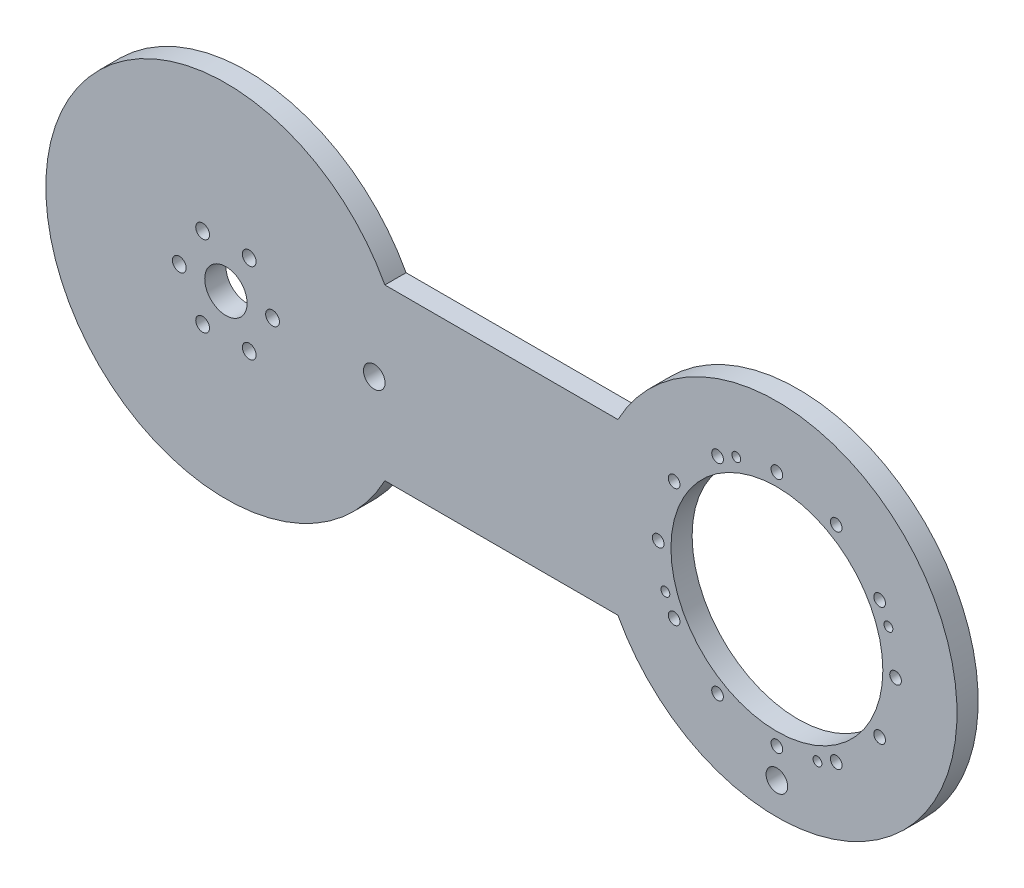
ISO-10303-21;
HEADER;
FILE_DESCRIPTION(('STEP AP214'),'2;1');
FILE_NAME('part.step','',(''),(''),'','','');
FILE_SCHEMA(('AUTOMOTIVE_DESIGN { 1 0 10303 214 1 1 1 1 }'));
ENDSEC;
DATA;
#1=APPLICATION_CONTEXT('core data for automotive mechanical design processes');
#2=APPLICATION_PROTOCOL_DEFINITION('international standard','automotive_design',2000,#1);
#3=PRODUCT_CONTEXT('',#1,'mechanical');
#4=PRODUCT('Part','Part','',(#3));
#5=PRODUCT_RELATED_PRODUCT_CATEGORY('part','',(#4));
#6=PRODUCT_DEFINITION_FORMATION('','',#4);
#7=PRODUCT_DEFINITION_CONTEXT('part definition',#1,'design');
#8=PRODUCT_DEFINITION('design','',#6,#7);
#9=PRODUCT_DEFINITION_SHAPE('','',#8);
#10=(LENGTH_UNIT() NAMED_UNIT(*) SI_UNIT(.MILLI.,.METRE.));
#11=(NAMED_UNIT(*) PLANE_ANGLE_UNIT() SI_UNIT($,.RADIAN.));
#12=(NAMED_UNIT(*) SI_UNIT($,.STERADIAN.) SOLID_ANGLE_UNIT());
#13=UNCERTAINTY_MEASURE_WITH_UNIT(LENGTH_MEASURE(1.E-05),#10,'distance_accuracy_value','');
#14=(GEOMETRIC_REPRESENTATION_CONTEXT(3) GLOBAL_UNCERTAINTY_ASSIGNED_CONTEXT((#13)) GLOBAL_UNIT_ASSIGNED_CONTEXT((#10,
#11,#12)) REPRESENTATION_CONTEXT('',''));
#15=CARTESIAN_POINT('',(0.,0.,0.));
#16=DIRECTION('',(0.,0.,1.));
#17=DIRECTION('',(1.,0.,0.));
#18=AXIS2_PLACEMENT_3D('',#15,#16,#17);
#19=CARTESIAN_POINT('',(0.,-40.,10.));
#20=DIRECTION('',(0.,1.,0.));
#21=DIRECTION('',(0.,0.,1.));
#22=AXIS2_PLACEMENT_3D('',#19,#20,#21);
#23=PLANE('',#22);
#24=DIRECTION('',(0.,0.,-1.));
#25=VECTOR('',#24,1.);
#26=CARTESIAN_POINT('',(185.,-40.,10.));
#27=LINE('',#26,#25);
#28=CARTESIAN_POINT('',(185.,-40.,10.));
#29=VERTEX_POINT('',#28);
#30=CARTESIAN_POINT('',(185.,-40.,0.));
#31=VERTEX_POINT('',#30);
#32=EDGE_CURVE('E67',#29,#31,#27,.T.);
#33=ORIENTED_EDGE('',*,*,#32,.F.);
#34=DIRECTION('',(1.,0.,0.));
#35=VECTOR('',#34,1.);
#36=CARTESIAN_POINT('',(0.,-40.,10.));
#37=LINE('',#36,#35);
#38=CARTESIAN_POINT('',(75.,-40.,10.));
#39=VERTEX_POINT('',#38);
#40=EDGE_CURVE('E98',#39,#29,#37,.T.);
#41=ORIENTED_EDGE('',*,*,#40,.F.);
#42=DIRECTION('',(0.,0.,-1.));
#43=VECTOR('',#42,1.);
#44=CARTESIAN_POINT('',(75.,-40.,10.));
#45=LINE('',#44,#43);
#46=CARTESIAN_POINT('',(75.,-40.,0.));
#47=VERTEX_POINT('',#46);
#48=EDGE_CURVE('E104',#39,#47,#45,.T.);
#49=ORIENTED_EDGE('',*,*,#48,.T.);
#50=DIRECTION('',(1.,0.,0.));
#51=VECTOR('',#50,1.);
#52=CARTESIAN_POINT('',(0.,-40.,0.));
#53=LINE('',#52,#51);
#54=EDGE_CURVE('E63',#47,#31,#53,.T.);
#55=ORIENTED_EDGE('',*,*,#54,.T.);
#56=EDGE_LOOP('',(#33,#41,#49,#55));
#57=FACE_BOUND('',#56,.T.);
#58=ADVANCED_FACE('F47',(#57),#23,.F.);
#59=CARTESIAN_POINT('',(260.,40.,10.));
#60=DIRECTION('',(0.,-1.,0.));
#61=DIRECTION('',(0.,0.,-1.));
#62=AXIS2_PLACEMENT_3D('',#59,#60,#61);
#63=PLANE('',#62);
#64=DIRECTION('',(0.,0.,-1.));
#65=VECTOR('',#64,1.);
#66=CARTESIAN_POINT('',(185.,40.,10.));
#67=LINE('',#66,#65);
#68=CARTESIAN_POINT('',(185.,40.,0.));
#69=VERTEX_POINT('',#68);
#70=CARTESIAN_POINT('',(185.,40.,10.));
#71=VERTEX_POINT('',#70);
#72=EDGE_CURVE('E11',#69,#71,#67,.F.);
#73=ORIENTED_EDGE('',*,*,#72,.F.);
#74=DIRECTION('',(-1.,0.,0.));
#75=VECTOR('',#74,1.);
#76=CARTESIAN_POINT('',(260.,40.,0.));
#77=LINE('',#76,#75);
#78=CARTESIAN_POINT('',(75.,40.,0.));
#79=VERTEX_POINT('',#78);
#80=EDGE_CURVE('E89',#69,#79,#77,.T.);
#81=ORIENTED_EDGE('',*,*,#80,.T.);
#82=DIRECTION('',(0.,0.,-1.));
#83=VECTOR('',#82,1.);
#84=CARTESIAN_POINT('',(75.,40.,10.));
#85=LINE('',#84,#83);
#86=CARTESIAN_POINT('',(75.,40.,10.));
#87=VERTEX_POINT('',#86);
#88=EDGE_CURVE('E93',#79,#87,#85,.F.);
#89=ORIENTED_EDGE('',*,*,#88,.T.);
#90=DIRECTION('',(-1.,0.,0.));
#91=VECTOR('',#90,1.);
#92=CARTESIAN_POINT('',(260.,40.,10.));
#93=LINE('',#92,#91);
#94=EDGE_CURVE('E108',#71,#87,#93,.T.);
#95=ORIENTED_EDGE('',*,*,#94,.F.);
#96=EDGE_LOOP('',(#73,#81,#89,#95));
#97=FACE_BOUND('',#96,.T.);
#98=ADVANCED_FACE('F91',(#97),#63,.F.);
#99=CARTESIAN_POINT('',(0.,0.,10.));
#100=DIRECTION('',(0.,0.,-1.));
#101=DIRECTION('',(-1.,0.,0.));
#102=AXIS2_PLACEMENT_3D('',#99,#100,#101);
#103=CYLINDRICAL_SURFACE('',#102,85.);
#104=ORIENTED_EDGE('',*,*,#48,.F.);
#105=CARTESIAN_POINT('',(0.,0.,10.));
#106=DIRECTION('',(0.,0.,1.));
#107=DIRECTION('',(1.,0.,0.));
#108=AXIS2_PLACEMENT_3D('',#105,#106,#107);
#109=CIRCLE('',#108,85.);
#110=EDGE_CURVE('E56',#87,#39,#109,.T.);
#111=ORIENTED_EDGE('',*,*,#110,.F.);
#112=ORIENTED_EDGE('',*,*,#88,.F.);
#113=CARTESIAN_POINT('',(0.,0.,0.));
#114=DIRECTION('',(0.,0.,1.));
#115=DIRECTION('',(1.,0.,0.));
#116=AXIS2_PLACEMENT_3D('',#113,#114,#115);
#117=CIRCLE('',#116,85.);
#118=EDGE_CURVE('E100',#79,#47,#117,.T.);
#119=ORIENTED_EDGE('',*,*,#118,.T.);
#120=EDGE_LOOP('',(#104,#111,#112,#119));
#121=FACE_BOUND('',#120,.T.);
#122=ADVANCED_FACE('F49',(#121),#103,.T.);
#123=CARTESIAN_POINT('',(0.,0.,10.));
#124=DIRECTION('',(0.,0.,1.));
#125=DIRECTION('',(1.,0.,0.));
#126=AXIS2_PLACEMENT_3D('',#123,#124,#125);
#127=PLANE('',#126);
#128=CARTESIAN_POINT('',(308.497422611929,28.,10.));
#129=DIRECTION('',(0.,0.,1.));
#130=DIRECTION('',(1.,0.,0.));
#131=AXIS2_PLACEMENT_3D('',#128,#129,#130);
#132=CIRCLE('',#131,2.74999999999997);
#133=CARTESIAN_POINT('',(311.247422611929,28.,10.));
#134=VERTEX_POINT('',#133);
#135=EDGE_CURVE('E133',#134,#134,#132,.T.);
#136=ORIENTED_EDGE('',*,*,#135,.F.);
#137=EDGE_LOOP('',(#136));
#138=FACE_BOUND('',#137,.T.);
#139=CARTESIAN_POINT('',(288.,48.4974226119286,10.));
#140=DIRECTION('',(0.,0.,1.));
#141=DIRECTION('',(1.,0.,0.));
#142=AXIS2_PLACEMENT_3D('',#139,#140,#141);
#143=CIRCLE('',#142,2.74999999999997);
#144=CARTESIAN_POINT('',(290.75,48.4974226119286,10.));
#145=VERTEX_POINT('',#144);
#146=EDGE_CURVE('E138',#145,#145,#143,.T.);
#147=ORIENTED_EDGE('',*,*,#146,.F.);
#148=EDGE_LOOP('',(#147));
#149=FACE_BOUND('',#148,.T.);
#150=CARTESIAN_POINT('',(260.,56.,10.));
#151=DIRECTION('',(0.,0.,1.));
#152=DIRECTION('',(1.,0.,0.));
#153=AXIS2_PLACEMENT_3D('',#150,#151,#152);
#154=CIRCLE('',#153,2.74999999999997);
#155=CARTESIAN_POINT('',(262.75,56.,10.));
#156=VERTEX_POINT('',#155);
#157=EDGE_CURVE('E142',#156,#156,#154,.T.);
#158=ORIENTED_EDGE('',*,*,#157,.F.);
#159=EDGE_LOOP('',(#158));
#160=FACE_BOUND('',#159,.T.);
#161=CARTESIAN_POINT('',(232.,48.4974226119286,10.));
#162=DIRECTION('',(0.,0.,1.));
#163=DIRECTION('',(1.,0.,0.));
#164=AXIS2_PLACEMENT_3D('',#161,#162,#163);
#165=CIRCLE('',#164,2.75);
#166=CARTESIAN_POINT('',(234.75,48.4974226119286,10.));
#167=VERTEX_POINT('',#166);
#168=EDGE_CURVE('E146',#167,#167,#165,.T.);
#169=ORIENTED_EDGE('',*,*,#168,.F.);
#170=EDGE_LOOP('',(#169));
#171=FACE_BOUND('',#170,.T.);
#172=CARTESIAN_POINT('',(211.502577388071,28.,10.));
#173=DIRECTION('',(0.,0.,1.));
#174=DIRECTION('',(1.,0.,0.));
#175=AXIS2_PLACEMENT_3D('',#172,#173,#174);
#176=CIRCLE('',#175,2.75);
#177=CARTESIAN_POINT('',(214.252577388071,28.,10.));
#178=VERTEX_POINT('',#177);
#179=EDGE_CURVE('E150',#178,#178,#176,.T.);
#180=ORIENTED_EDGE('',*,*,#179,.F.);
#181=EDGE_LOOP('',(#180));
#182=FACE_BOUND('',#181,.T.);
#183=CARTESIAN_POINT('',(204.,0.,10.));
#184=DIRECTION('',(0.,0.,1.));
#185=DIRECTION('',(1.,0.,0.));
#186=AXIS2_PLACEMENT_3D('',#183,#184,#185);
#187=CIRCLE('',#186,2.75);
#188=CARTESIAN_POINT('',(206.75,0.,10.));
#189=VERTEX_POINT('',#188);
#190=EDGE_CURVE('E154',#189,#189,#187,.T.);
#191=ORIENTED_EDGE('',*,*,#190,.F.);
#192=EDGE_LOOP('',(#191));
#193=FACE_BOUND('',#192,.T.);
#194=CARTESIAN_POINT('',(211.502577388071,-28.,10.));
#195=DIRECTION('',(0.,0.,1.));
#196=DIRECTION('',(1.,0.,0.));
#197=AXIS2_PLACEMENT_3D('',#194,#195,#196);
#198=CIRCLE('',#197,2.75);
#199=CARTESIAN_POINT('',(214.252577388071,-28.,10.));
#200=VERTEX_POINT('',#199);
#201=EDGE_CURVE('E158',#200,#200,#198,.T.);
#202=ORIENTED_EDGE('',*,*,#201,.F.);
#203=EDGE_LOOP('',(#202));
#204=FACE_BOUND('',#203,.T.);
#205=CARTESIAN_POINT('',(232.,-48.4974226119286,10.));
#206=DIRECTION('',(0.,0.,1.));
#207=DIRECTION('',(1.,0.,0.));
#208=AXIS2_PLACEMENT_3D('',#205,#206,#207);
#209=CIRCLE('',#208,2.75);
#210=CARTESIAN_POINT('',(234.75,-48.4974226119286,10.));
#211=VERTEX_POINT('',#210);
#212=EDGE_CURVE('E162',#211,#211,#209,.T.);
#213=ORIENTED_EDGE('',*,*,#212,.F.);
#214=EDGE_LOOP('',(#213));
#215=FACE_BOUND('',#214,.T.);
#216=CARTESIAN_POINT('',(22.,0.,10.));
#217=DIRECTION('',(0.,0.,1.));
#218=DIRECTION('',(1.,0.,0.));
#219=AXIS2_PLACEMENT_3D('',#216,#217,#218);
#220=CIRCLE('',#219,3.25);
#221=CARTESIAN_POINT('',(25.25,0.,10.));
#222=VERTEX_POINT('',#221);
#223=EDGE_CURVE('E166',#222,#222,#220,.T.);
#224=ORIENTED_EDGE('',*,*,#223,.F.);
#225=EDGE_LOOP('',(#224));
#226=FACE_BOUND('',#225,.T.);
#227=CARTESIAN_POINT('',(11.,19.0525588832576,10.));
#228=DIRECTION('',(0.,0.,1.));
#229=DIRECTION('',(1.,0.,0.));
#230=AXIS2_PLACEMENT_3D('',#227,#228,#229);
#231=CIRCLE('',#230,3.25);
#232=CARTESIAN_POINT('',(14.25,19.0525588832576,10.));
#233=VERTEX_POINT('',#232);
#234=EDGE_CURVE('E170',#233,#233,#231,.T.);
#235=ORIENTED_EDGE('',*,*,#234,.F.);
#236=EDGE_LOOP('',(#235));
#237=FACE_BOUND('',#236,.T.);
#238=CARTESIAN_POINT('',(-11.,19.0525588832577,10.));
#239=DIRECTION('',(0.,0.,1.));
#240=DIRECTION('',(1.,0.,0.));
#241=AXIS2_PLACEMENT_3D('',#238,#239,#240);
#242=CIRCLE('',#241,3.25);
#243=CARTESIAN_POINT('',(-7.74999999999999,19.0525588832577,10.));
#244=VERTEX_POINT('',#243);
#245=EDGE_CURVE('E174',#244,#244,#242,.T.);
#246=ORIENTED_EDGE('',*,*,#245,.F.);
#247=EDGE_LOOP('',(#246));
#248=FACE_BOUND('',#247,.T.);
#249=CARTESIAN_POINT('',(-22.,0.,10.));
#250=DIRECTION('',(0.,0.,1.));
#251=DIRECTION('',(1.,0.,0.));
#252=AXIS2_PLACEMENT_3D('',#249,#250,#251);
#253=CIRCLE('',#252,3.25);
#254=CARTESIAN_POINT('',(-18.75,0.,10.));
#255=VERTEX_POINT('',#254);
#256=EDGE_CURVE('E178',#255,#255,#253,.T.);
#257=ORIENTED_EDGE('',*,*,#256,.F.);
#258=EDGE_LOOP('',(#257));
#259=FACE_BOUND('',#258,.T.);
#260=CARTESIAN_POINT('',(-11.,-19.0525588832576,10.));
#261=DIRECTION('',(0.,0.,1.));
#262=DIRECTION('',(1.,0.,0.));
#263=AXIS2_PLACEMENT_3D('',#260,#261,#262);
#264=CIRCLE('',#263,3.25);
#265=CARTESIAN_POINT('',(-7.75000000000001,-19.0525588832576,10.));
#266=VERTEX_POINT('',#265);
#267=EDGE_CURVE('E182',#266,#266,#264,.T.);
#268=ORIENTED_EDGE('',*,*,#267,.F.);
#269=EDGE_LOOP('',(#268));
#270=FACE_BOUND('',#269,.T.);
#271=CARTESIAN_POINT('',(11.,-19.0525588832576,10.));
#272=DIRECTION('',(0.,0.,1.));
#273=DIRECTION('',(1.,0.,0.));
#274=AXIS2_PLACEMENT_3D('',#271,#272,#273);
#275=CIRCLE('',#274,3.25);
#276=CARTESIAN_POINT('',(14.25,-19.0525588832576,10.));
#277=VERTEX_POINT('',#276);
#278=EDGE_CURVE('E186',#277,#277,#275,.T.);
#279=ORIENTED_EDGE('',*,*,#278,.F.);
#280=EDGE_LOOP('',(#279));
#281=FACE_BOUND('',#280,.T.);
#282=CARTESIAN_POINT('',(260.,0.,10.));
#283=DIRECTION('',(0.,0.,1.));
#284=DIRECTION('',(1.,0.,0.));
#285=AXIS2_PLACEMENT_3D('',#282,#283,#284);
#286=CIRCLE('',#285,50.);
#287=CARTESIAN_POINT('',(310.,0.,10.));
#288=VERTEX_POINT('',#287);
#289=EDGE_CURVE('E190',#288,#288,#286,.T.);
#290=ORIENTED_EDGE('',*,*,#289,.F.);
#291=EDGE_LOOP('',(#290));
#292=FACE_BOUND('',#291,.T.);
#293=CARTESIAN_POINT('',(316.,0.,10.));
#294=DIRECTION('',(0.,0.,1.));
#295=DIRECTION('',(1.,0.,0.));
#296=AXIS2_PLACEMENT_3D('',#293,#294,#295);
#297=CIRCLE('',#296,2.74999999999997);
#298=CARTESIAN_POINT('',(318.75,0.,10.));
#299=VERTEX_POINT('',#298);
#300=EDGE_CURVE('E194',#299,#299,#297,.T.);
#301=ORIENTED_EDGE('',*,*,#300,.F.);
#302=EDGE_LOOP('',(#301));
#303=FACE_BOUND('',#302,.T.);
#304=CARTESIAN_POINT('',(240.846871973763,52.6227867640109,10.));
#305=DIRECTION('',(0.,0.,1.));
#306=DIRECTION('',(1.,0.,0.));
#307=AXIS2_PLACEMENT_3D('',#304,#305,#306);
#308=CIRCLE('',#307,2.09999999999999);
#309=CARTESIAN_POINT('',(242.946871973763,52.6227867640109,10.));
#310=VERTEX_POINT('',#309);
#311=EDGE_CURVE('E198',#310,#310,#308,.T.);
#312=ORIENTED_EDGE('',*,*,#311,.F.);
#313=EDGE_LOOP('',(#312));
#314=FACE_BOUND('',#313,.T.);
#315=CARTESIAN_POINT('',(207.377213235989,-19.1531280262374,10.));
#316=DIRECTION('',(0.,0.,1.));
#317=DIRECTION('',(1.,0.,0.));
#318=AXIS2_PLACEMENT_3D('',#315,#316,#317);
#319=CIRCLE('',#318,2.09999999999999);
#320=CARTESIAN_POINT('',(209.477213235989,-19.1531280262374,10.));
#321=VERTEX_POINT('',#320);
#322=EDGE_CURVE('E202',#321,#321,#319,.T.);
#323=ORIENTED_EDGE('',*,*,#322,.F.);
#324=EDGE_LOOP('',(#323));
#325=FACE_BOUND('',#324,.T.);
#326=CARTESIAN_POINT('',(279.153128026237,-52.6227867640109,10.));
#327=DIRECTION('',(0.,0.,1.));
#328=DIRECTION('',(1.,0.,0.));
#329=AXIS2_PLACEMENT_3D('',#326,#327,#328);
#330=CIRCLE('',#329,2.09999999999999);
#331=CARTESIAN_POINT('',(281.253128026237,-52.6227867640109,10.));
#332=VERTEX_POINT('',#331);
#333=EDGE_CURVE('E206',#332,#332,#330,.T.);
#334=ORIENTED_EDGE('',*,*,#333,.F.);
#335=EDGE_LOOP('',(#334));
#336=FACE_BOUND('',#335,.T.);
#337=CARTESIAN_POINT('',(70.,0.,10.));
#338=DIRECTION('',(0.,0.,1.));
#339=DIRECTION('',(1.,0.,0.));
#340=AXIS2_PLACEMENT_3D('',#337,#338,#339);
#341=CIRCLE('',#340,5.09999999999999);
#342=CARTESIAN_POINT('',(75.1,0.,10.));
#343=VERTEX_POINT('',#342);
#344=EDGE_CURVE('E210',#343,#343,#341,.T.);
#345=ORIENTED_EDGE('',*,*,#344,.F.);
#346=EDGE_LOOP('',(#345));
#347=FACE_BOUND('',#346,.T.);
#348=CARTESIAN_POINT('',(312.622786764011,19.1531280262374,10.));
#349=DIRECTION('',(0.,0.,1.));
#350=DIRECTION('',(1.,0.,0.));
#351=AXIS2_PLACEMENT_3D('',#348,#349,#350);
#352=CIRCLE('',#351,2.09999999999999);
#353=CARTESIAN_POINT('',(314.722786764011,19.1531280262374,10.));
#354=VERTEX_POINT('',#353);
#355=EDGE_CURVE('E214',#354,#354,#352,.T.);
#356=ORIENTED_EDGE('',*,*,#355,.F.);
#357=EDGE_LOOP('',(#356));
#358=FACE_BOUND('',#357,.T.);
#359=CARTESIAN_POINT('',(308.497422611929,-28.,10.));
#360=DIRECTION('',(0.,0.,1.));
#361=DIRECTION('',(1.,0.,0.));
#362=AXIS2_PLACEMENT_3D('',#359,#360,#361);
#363=CIRCLE('',#362,2.74999999999997);
#364=CARTESIAN_POINT('',(311.247422611929,-28.,10.));
#365=VERTEX_POINT('',#364);
#366=EDGE_CURVE('E218',#365,#365,#363,.T.);
#367=ORIENTED_EDGE('',*,*,#366,.F.);
#368=EDGE_LOOP('',(#367));
#369=FACE_BOUND('',#368,.T.);
#370=CARTESIAN_POINT('',(288.,-48.4974226119286,10.));
#371=DIRECTION('',(0.,0.,1.));
#372=DIRECTION('',(1.,0.,0.));
#373=AXIS2_PLACEMENT_3D('',#370,#371,#372);
#374=CIRCLE('',#373,2.74999999999997);
#375=CARTESIAN_POINT('',(290.75,-48.4974226119286,10.));
#376=VERTEX_POINT('',#375);
#377=EDGE_CURVE('E222',#376,#376,#374,.T.);
#378=ORIENTED_EDGE('',*,*,#377,.F.);
#379=EDGE_LOOP('',(#378));
#380=FACE_BOUND('',#379,.T.);
#381=CARTESIAN_POINT('',(260.,-56.,10.));
#382=DIRECTION('',(0.,0.,1.));
#383=DIRECTION('',(1.,0.,0.));
#384=AXIS2_PLACEMENT_3D('',#381,#382,#383);
#385=CIRCLE('',#384,2.74999999999997);
#386=CARTESIAN_POINT('',(262.75,-56.,10.));
#387=VERTEX_POINT('',#386);
#388=EDGE_CURVE('E226',#387,#387,#385,.T.);
#389=ORIENTED_EDGE('',*,*,#388,.F.);
#390=EDGE_LOOP('',(#389));
#391=FACE_BOUND('',#390,.T.);
#392=CARTESIAN_POINT('',(260.,-70.,10.));
#393=DIRECTION('',(0.,0.,1.));
#394=DIRECTION('',(1.,0.,0.));
#395=AXIS2_PLACEMENT_3D('',#392,#393,#394);
#396=CIRCLE('',#395,5.09999999999999);
#397=CARTESIAN_POINT('',(265.1,-70.,10.));
#398=VERTEX_POINT('',#397);
#399=EDGE_CURVE('E230',#398,#398,#396,.T.);
#400=ORIENTED_EDGE('',*,*,#399,.F.);
#401=EDGE_LOOP('',(#400));
#402=FACE_BOUND('',#401,.T.);
#403=CARTESIAN_POINT('',(0.,0.,10.));
#404=DIRECTION('',(0.,0.,1.));
#405=DIRECTION('',(1.,0.,0.));
#406=AXIS2_PLACEMENT_3D('',#403,#404,#405);
#407=CIRCLE('',#406,10.);
#408=CARTESIAN_POINT('',(10.,0.,10.));
#409=VERTEX_POINT('',#408);
#410=EDGE_CURVE('E234',#409,#409,#407,.T.);
#411=ORIENTED_EDGE('',*,*,#410,.F.);
#412=EDGE_LOOP('',(#411));
#413=FACE_BOUND('',#412,.T.);
#414=ORIENTED_EDGE('',*,*,#40,.T.);
#415=CARTESIAN_POINT('',(260.,0.,10.));
#416=DIRECTION('',(0.,0.,1.));
#417=DIRECTION('',(1.,0.,0.));
#418=AXIS2_PLACEMENT_3D('',#415,#416,#417);
#419=CIRCLE('',#418,85.);
#420=EDGE_CURVE('E127',#29,#71,#419,.T.);
#421=ORIENTED_EDGE('',*,*,#420,.T.);
#422=ORIENTED_EDGE('',*,*,#94,.T.);
#423=ORIENTED_EDGE('',*,*,#110,.T.);
#424=EDGE_LOOP('',(#414,#421,#422,#423));
#425=FACE_BOUND('',#424,.T.);
#426=ADVANCED_FACE('F118',(#138,#149,#160,#171,#182,#193,#204,#215,#226,#237,#248,#259,#270,
#281,#292,#303,#314,#325,#336,#347,#358,#369,#380,#391,#402,#413,#425),#127,.T.);
#427=CARTESIAN_POINT('',(0.,0.,0.));
#428=DIRECTION('',(0.,0.,1.));
#429=DIRECTION('',(1.,0.,0.));
#430=AXIS2_PLACEMENT_3D('',#427,#428,#429);
#431=PLANE('',#430);
#432=CARTESIAN_POINT('',(308.497422611929,28.,0.));
#433=DIRECTION('',(0.,0.,-1.));
#434=DIRECTION('',(-1.,0.,0.));
#435=AXIS2_PLACEMENT_3D('',#432,#433,#434);
#436=CIRCLE('',#435,2.74999999999997);
#437=CARTESIAN_POINT('',(305.747422611929,28.,0.));
#438=VERTEX_POINT('',#437);
#439=EDGE_CURVE('E264',#438,#438,#436,.T.);
#440=ORIENTED_EDGE('',*,*,#439,.F.);
#441=EDGE_LOOP('',(#440));
#442=FACE_BOUND('',#441,.T.);
#443=CARTESIAN_POINT('',(288.,48.4974226119286,0.));
#444=DIRECTION('',(0.,0.,-1.));
#445=DIRECTION('',(-1.,0.,0.));
#446=AXIS2_PLACEMENT_3D('',#443,#444,#445);
#447=CIRCLE('',#446,2.74999999999997);
#448=CARTESIAN_POINT('',(285.25,48.4974226119286,0.));
#449=VERTEX_POINT('',#448);
#450=EDGE_CURVE('E284',#449,#449,#447,.T.);
#451=ORIENTED_EDGE('',*,*,#450,.F.);
#452=EDGE_LOOP('',(#451));
#453=FACE_BOUND('',#452,.T.);
#454=CARTESIAN_POINT('',(260.,56.,0.));
#455=DIRECTION('',(0.,0.,-1.));
#456=DIRECTION('',(-1.,0.,0.));
#457=AXIS2_PLACEMENT_3D('',#454,#455,#456);
#458=CIRCLE('',#457,2.74999999999997);
#459=CARTESIAN_POINT('',(257.25,56.,0.));
#460=VERTEX_POINT('',#459);
#461=EDGE_CURVE('E279',#460,#460,#458,.T.);
#462=ORIENTED_EDGE('',*,*,#461,.F.);
#463=EDGE_LOOP('',(#462));
#464=FACE_BOUND('',#463,.T.);
#465=CARTESIAN_POINT('',(232.,48.4974226119286,0.));
#466=DIRECTION('',(0.,0.,-1.));
#467=DIRECTION('',(-1.,0.,0.));
#468=AXIS2_PLACEMENT_3D('',#465,#466,#467);
#469=CIRCLE('',#468,2.75);
#470=CARTESIAN_POINT('',(229.25,48.4974226119286,0.));
#471=VERTEX_POINT('',#470);
#472=EDGE_CURVE('E275',#471,#471,#469,.T.);
#473=ORIENTED_EDGE('',*,*,#472,.F.);
#474=EDGE_LOOP('',(#473));
#475=FACE_BOUND('',#474,.T.);
#476=CARTESIAN_POINT('',(211.502577388071,28.,0.));
#477=DIRECTION('',(0.,0.,-1.));
#478=DIRECTION('',(-1.,0.,0.));
#479=AXIS2_PLACEMENT_3D('',#476,#477,#478);
#480=CIRCLE('',#479,2.75);
#481=CARTESIAN_POINT('',(208.752577388071,28.,0.));
#482=VERTEX_POINT('',#481);
#483=EDGE_CURVE('E280',#482,#482,#480,.T.);
#484=ORIENTED_EDGE('',*,*,#483,.F.);
#485=EDGE_LOOP('',(#484));
#486=FACE_BOUND('',#485,.T.);
#487=CARTESIAN_POINT('',(204.,0.,0.));
#488=DIRECTION('',(0.,0.,-1.));
#489=DIRECTION('',(-1.,0.,0.));
#490=AXIS2_PLACEMENT_3D('',#487,#488,#489);
#491=CIRCLE('',#490,2.75);
#492=CARTESIAN_POINT('',(201.25,0.,0.));
#493=VERTEX_POINT('',#492);
#494=EDGE_CURVE('E300',#493,#493,#491,.T.);
#495=ORIENTED_EDGE('',*,*,#494,.F.);
#496=EDGE_LOOP('',(#495));
#497=FACE_BOUND('',#496,.T.);
#498=CARTESIAN_POINT('',(211.502577388071,-28.,0.));
#499=DIRECTION('',(0.,0.,-1.));
#500=DIRECTION('',(-1.,0.,0.));
#501=AXIS2_PLACEMENT_3D('',#498,#499,#500);
#502=CIRCLE('',#501,2.75);
#503=CARTESIAN_POINT('',(208.752577388071,-28.,0.));
#504=VERTEX_POINT('',#503);
#505=EDGE_CURVE('E295',#504,#504,#502,.T.);
#506=ORIENTED_EDGE('',*,*,#505,.F.);
#507=EDGE_LOOP('',(#506));
#508=FACE_BOUND('',#507,.T.);
#509=CARTESIAN_POINT('',(232.,-48.4974226119286,0.));
#510=DIRECTION('',(0.,0.,-1.));
#511=DIRECTION('',(-1.,0.,0.));
#512=AXIS2_PLACEMENT_3D('',#509,#510,#511);
#513=CIRCLE('',#512,2.75);
#514=CARTESIAN_POINT('',(229.25,-48.4974226119286,0.));
#515=VERTEX_POINT('',#514);
#516=EDGE_CURVE('E291',#515,#515,#513,.T.);
#517=ORIENTED_EDGE('',*,*,#516,.F.);
#518=EDGE_LOOP('',(#517));
#519=FACE_BOUND('',#518,.T.);
#520=CARTESIAN_POINT('',(22.,0.,0.));
#521=DIRECTION('',(0.,0.,-1.));
#522=DIRECTION('',(-1.,0.,0.));
#523=AXIS2_PLACEMENT_3D('',#520,#521,#522);
#524=CIRCLE('',#523,3.25);
#525=CARTESIAN_POINT('',(18.75,0.,0.));
#526=VERTEX_POINT('',#525);
#527=EDGE_CURVE('E242',#526,#526,#524,.T.);
#528=ORIENTED_EDGE('',*,*,#527,.F.);
#529=EDGE_LOOP('',(#528));
#530=FACE_BOUND('',#529,.T.);
#531=CARTESIAN_POINT('',(11.,19.0525588832576,0.));
#532=DIRECTION('',(0.,0.,-1.));
#533=DIRECTION('',(-1.,0.,0.));
#534=AXIS2_PLACEMENT_3D('',#531,#532,#533);
#535=CIRCLE('',#534,3.25);
#536=CARTESIAN_POINT('',(7.75,19.0525588832576,0.));
#537=VERTEX_POINT('',#536);
#538=EDGE_CURVE('E252',#537,#537,#535,.T.);
#539=ORIENTED_EDGE('',*,*,#538,.F.);
#540=EDGE_LOOP('',(#539));
#541=FACE_BOUND('',#540,.T.);
#542=CARTESIAN_POINT('',(-11.,19.0525588832577,0.));
#543=DIRECTION('',(0.,0.,-1.));
#544=DIRECTION('',(-1.,0.,0.));
#545=AXIS2_PLACEMENT_3D('',#542,#543,#544);
#546=CIRCLE('',#545,3.25);
#547=CARTESIAN_POINT('',(-14.25,19.0525588832577,0.));
#548=VERTEX_POINT('',#547);
#549=EDGE_CURVE('E247',#548,#548,#546,.T.);
#550=ORIENTED_EDGE('',*,*,#549,.F.);
#551=EDGE_LOOP('',(#550));
#552=FACE_BOUND('',#551,.T.);
#553=CARTESIAN_POINT('',(-22.,0.,0.));
#554=DIRECTION('',(0.,0.,-1.));
#555=DIRECTION('',(-1.,0.,0.));
#556=AXIS2_PLACEMENT_3D('',#553,#554,#555);
#557=CIRCLE('',#556,3.25);
#558=CARTESIAN_POINT('',(-25.25,0.,0.));
#559=VERTEX_POINT('',#558);
#560=EDGE_CURVE('E243',#559,#559,#557,.T.);
#561=ORIENTED_EDGE('',*,*,#560,.F.);
#562=EDGE_LOOP('',(#561));
#563=FACE_BOUND('',#562,.T.);
#564=CARTESIAN_POINT('',(-11.,-19.0525588832576,0.));
#565=DIRECTION('',(0.,0.,-1.));
#566=DIRECTION('',(-1.,0.,0.));
#567=AXIS2_PLACEMENT_3D('',#564,#565,#566);
#568=CIRCLE('',#567,3.25);
#569=CARTESIAN_POINT('',(-14.25,-19.0525588832576,0.));
#570=VERTEX_POINT('',#569);
#571=EDGE_CURVE('E248',#570,#570,#568,.T.);
#572=ORIENTED_EDGE('',*,*,#571,.F.);
#573=EDGE_LOOP('',(#572));
#574=FACE_BOUND('',#573,.T.);
#575=CARTESIAN_POINT('',(11.,-19.0525588832576,0.));
#576=DIRECTION('',(0.,0.,-1.));
#577=DIRECTION('',(-1.,0.,0.));
#578=AXIS2_PLACEMENT_3D('',#575,#576,#577);
#579=CIRCLE('',#578,3.25);
#580=CARTESIAN_POINT('',(7.75,-19.0525588832576,0.));
#581=VERTEX_POINT('',#580);
#582=EDGE_CURVE('E268',#581,#581,#579,.T.);
#583=ORIENTED_EDGE('',*,*,#582,.F.);
#584=EDGE_LOOP('',(#583));
#585=FACE_BOUND('',#584,.T.);
#586=CARTESIAN_POINT('',(260.,0.,0.));
#587=DIRECTION('',(0.,0.,-1.));
#588=DIRECTION('',(-1.,0.,0.));
#589=AXIS2_PLACEMENT_3D('',#586,#587,#588);
#590=CIRCLE('',#589,50.);
#591=CARTESIAN_POINT('',(210.,0.,0.));
#592=VERTEX_POINT('',#591);
#593=EDGE_CURVE('E263',#592,#592,#590,.T.);
#594=ORIENTED_EDGE('',*,*,#593,.F.);
#595=EDGE_LOOP('',(#594));
#596=FACE_BOUND('',#595,.T.);
#597=CARTESIAN_POINT('',(316.,0.,0.));
#598=DIRECTION('',(0.,0.,-1.));
#599=DIRECTION('',(-1.,0.,0.));
#600=AXIS2_PLACEMENT_3D('',#597,#598,#599);
#601=CIRCLE('',#600,2.74999999999997);
#602=CARTESIAN_POINT('',(313.25,0.,0.));
#603=VERTEX_POINT('',#602);
#604=EDGE_CURVE('E259',#603,#603,#601,.T.);
#605=ORIENTED_EDGE('',*,*,#604,.F.);
#606=EDGE_LOOP('',(#605));
#607=FACE_BOUND('',#606,.T.);
#608=CARTESIAN_POINT('',(240.846871973763,52.6227867640109,0.));
#609=DIRECTION('',(0.,0.,-1.));
#610=DIRECTION('',(-1.,0.,0.));
#611=AXIS2_PLACEMENT_3D('',#608,#609,#610);
#612=CIRCLE('',#611,2.09999999999999);
#613=CARTESIAN_POINT('',(238.746871973763,52.6227867640109,0.));
#614=VERTEX_POINT('',#613);
#615=EDGE_CURVE('E317',#614,#614,#612,.T.);
#616=ORIENTED_EDGE('',*,*,#615,.F.);
#617=EDGE_LOOP('',(#616));
#618=FACE_BOUND('',#617,.T.);
#619=CARTESIAN_POINT('',(207.377213235989,-19.1531280262374,0.));
#620=DIRECTION('',(0.,0.,-1.));
#621=DIRECTION('',(-1.,0.,0.));
#622=AXIS2_PLACEMENT_3D('',#619,#620,#621);
#623=CIRCLE('',#622,2.09999999999999);
#624=CARTESIAN_POINT('',(205.277213235989,-19.1531280262374,0.));
#625=VERTEX_POINT('',#624);
#626=EDGE_CURVE('E328',#625,#625,#623,.T.);
#627=ORIENTED_EDGE('',*,*,#626,.F.);
#628=EDGE_LOOP('',(#627));
#629=FACE_BOUND('',#628,.T.);
#630=CARTESIAN_POINT('',(279.153128026237,-52.6227867640109,0.));
#631=DIRECTION('',(0.,0.,-1.));
#632=DIRECTION('',(-1.,0.,0.));
#633=AXIS2_PLACEMENT_3D('',#630,#631,#632);
#634=CIRCLE('',#633,2.09999999999999);
#635=CARTESIAN_POINT('',(277.053128026238,-52.6227867640109,0.));
#636=VERTEX_POINT('',#635);
#637=EDGE_CURVE('E332',#636,#636,#634,.T.);
#638=ORIENTED_EDGE('',*,*,#637,.F.);
#639=EDGE_LOOP('',(#638));
#640=FACE_BOUND('',#639,.T.);
#641=CARTESIAN_POINT('',(70.,0.,0.));
#642=DIRECTION('',(0.,0.,-1.));
#643=DIRECTION('',(-1.,0.,0.));
#644=AXIS2_PLACEMENT_3D('',#641,#642,#643);
#645=CIRCLE('',#644,5.09999999999999);
#646=CARTESIAN_POINT('',(64.9,0.,0.));
#647=VERTEX_POINT('',#646);
#648=EDGE_CURVE('E311',#647,#647,#645,.T.);
#649=ORIENTED_EDGE('',*,*,#648,.F.);
#650=EDGE_LOOP('',(#649));
#651=FACE_BOUND('',#650,.T.);
#652=CARTESIAN_POINT('',(312.622786764011,19.1531280262374,0.));
#653=DIRECTION('',(0.,0.,-1.));
#654=DIRECTION('',(-1.,0.,0.));
#655=AXIS2_PLACEMENT_3D('',#652,#653,#654);
#656=CIRCLE('',#655,2.09999999999999);
#657=CARTESIAN_POINT('',(310.522786764011,19.1531280262374,0.));
#658=VERTEX_POINT('',#657);
#659=EDGE_CURVE('E312',#658,#658,#656,.T.);
#660=ORIENTED_EDGE('',*,*,#659,.F.);
#661=EDGE_LOOP('',(#660));
#662=FACE_BOUND('',#661,.T.);
#663=CARTESIAN_POINT('',(308.497422611929,-28.,0.));
#664=DIRECTION('',(0.,0.,-1.));
#665=DIRECTION('',(-1.,0.,0.));
#666=AXIS2_PLACEMENT_3D('',#663,#664,#665);
#667=CIRCLE('',#666,2.74999999999997);
#668=CARTESIAN_POINT('',(305.747422611929,-28.,0.));
#669=VERTEX_POINT('',#668);
#670=EDGE_CURVE('E316',#669,#669,#667,.T.);
#671=ORIENTED_EDGE('',*,*,#670,.F.);
#672=EDGE_LOOP('',(#671));
#673=FACE_BOUND('',#672,.T.);
#674=CARTESIAN_POINT('',(288.,-48.4974226119286,0.));
#675=DIRECTION('',(0.,0.,-1.));
#676=DIRECTION('',(-1.,0.,0.));
#677=AXIS2_PLACEMENT_3D('',#674,#675,#676);
#678=CIRCLE('',#677,2.74999999999997);
#679=CARTESIAN_POINT('',(285.25,-48.4974226119286,0.));
#680=VERTEX_POINT('',#679);
#681=EDGE_CURVE('E321',#680,#680,#678,.T.);
#682=ORIENTED_EDGE('',*,*,#681,.F.);
#683=EDGE_LOOP('',(#682));
#684=FACE_BOUND('',#683,.T.);
#685=CARTESIAN_POINT('',(260.,-56.,0.));
#686=DIRECTION('',(0.,0.,-1.));
#687=DIRECTION('',(-1.,0.,0.));
#688=AXIS2_PLACEMENT_3D('',#685,#686,#687);
#689=CIRCLE('',#688,2.74999999999997);
#690=CARTESIAN_POINT('',(257.25,-56.,0.));
#691=VERTEX_POINT('',#690);
#692=EDGE_CURVE('E296',#691,#691,#689,.T.);
#693=ORIENTED_EDGE('',*,*,#692,.F.);
#694=EDGE_LOOP('',(#693));
#695=FACE_BOUND('',#694,.T.);
#696=CARTESIAN_POINT('',(260.,-70.,0.));
#697=DIRECTION('',(0.,0.,-1.));
#698=DIRECTION('',(-1.,0.,0.));
#699=AXIS2_PLACEMENT_3D('',#696,#697,#698);
#700=CIRCLE('',#699,5.09999999999999);
#701=CARTESIAN_POINT('',(254.9,-70.,0.));
#702=VERTEX_POINT('',#701);
#703=EDGE_CURVE('E307',#702,#702,#700,.T.);
#704=ORIENTED_EDGE('',*,*,#703,.F.);
#705=EDGE_LOOP('',(#704));
#706=FACE_BOUND('',#705,.T.);
#707=CARTESIAN_POINT('',(0.,0.,0.));
#708=DIRECTION('',(0.,0.,-1.));
#709=DIRECTION('',(-1.,0.,0.));
#710=AXIS2_PLACEMENT_3D('',#707,#708,#709);
#711=CIRCLE('',#710,10.);
#712=CARTESIAN_POINT('',(-10.,0.,0.));
#713=VERTEX_POINT('',#712);
#714=EDGE_CURVE('E238',#713,#713,#711,.T.);
#715=ORIENTED_EDGE('',*,*,#714,.F.);
#716=EDGE_LOOP('',(#715));
#717=FACE_BOUND('',#716,.T.);
#718=ORIENTED_EDGE('',*,*,#80,.F.);
#719=CARTESIAN_POINT('',(260.,0.,0.));
#720=DIRECTION('',(0.,0.,1.));
#721=DIRECTION('',(1.,0.,0.));
#722=AXIS2_PLACEMENT_3D('',#719,#720,#721);
#723=CIRCLE('',#722,85.);
#724=EDGE_CURVE('E130',#31,#69,#723,.T.);
#725=ORIENTED_EDGE('',*,*,#724,.F.);
#726=ORIENTED_EDGE('',*,*,#54,.F.);
#727=ORIENTED_EDGE('',*,*,#118,.F.);
#728=EDGE_LOOP('',(#718,#725,#726,#727));
#729=FACE_BOUND('',#728,.T.);
#730=ADVANCED_FACE('F101',(#442,#453,#464,#475,#486,#497,#508,#519,#530,#541,#552,#563,#574,
#585,#596,#607,#618,#629,#640,#651,#662,#673,#684,#695,#706,#717,#729),#431,.F.);
#731=CARTESIAN_POINT('',(260.,0.,10.));
#732=DIRECTION('',(0.,0.,-1.));
#733=DIRECTION('',(-1.,0.,0.));
#734=AXIS2_PLACEMENT_3D('',#731,#732,#733);
#735=CYLINDRICAL_SURFACE('',#734,85.);
#736=ORIENTED_EDGE('',*,*,#420,.F.);
#737=ORIENTED_EDGE('',*,*,#32,.T.);
#738=ORIENTED_EDGE('',*,*,#724,.T.);
#739=ORIENTED_EDGE('',*,*,#72,.T.);
#740=EDGE_LOOP('',(#736,#737,#738,#739));
#741=FACE_BOUND('',#740,.T.);
#742=ADVANCED_FACE('F347',(#741),#735,.T.);
#743=CARTESIAN_POINT('',(0.,0.,11.));
#744=DIRECTION('',(0.,0.,-1.));
#745=DIRECTION('',(-1.,0.,0.));
#746=AXIS2_PLACEMENT_3D('',#743,#744,#745);
#747=CYLINDRICAL_SURFACE('',#746,10.);
#748=ORIENTED_EDGE('',*,*,#410,.T.);
#749=EDGE_LOOP('',(#748));
#750=FACE_BOUND('',#749,.T.);
#751=ORIENTED_EDGE('',*,*,#714,.T.);
#752=EDGE_LOOP('',(#751));
#753=FACE_BOUND('',#752,.T.);
#754=ADVANCED_FACE('F363',(#750,#753),#747,.F.);
#755=CARTESIAN_POINT('',(260.,-70.,11.));
#756=DIRECTION('',(0.,0.,-1.));
#757=DIRECTION('',(-1.,0.,0.));
#758=AXIS2_PLACEMENT_3D('',#755,#756,#757);
#759=CYLINDRICAL_SURFACE('',#758,5.09999999999999);
#760=ORIENTED_EDGE('',*,*,#399,.T.);
#761=EDGE_LOOP('',(#760));
#762=FACE_BOUND('',#761,.T.);
#763=ORIENTED_EDGE('',*,*,#703,.T.);
#764=EDGE_LOOP('',(#763));
#765=FACE_BOUND('',#764,.T.);
#766=ADVANCED_FACE('F365',(#762,#765),#759,.F.);
#767=CARTESIAN_POINT('',(260.,-56.,11.));
#768=DIRECTION('',(0.,0.,-1.));
#769=DIRECTION('',(-1.,0.,0.));
#770=AXIS2_PLACEMENT_3D('',#767,#768,#769);
#771=CYLINDRICAL_SURFACE('',#770,2.74999999999997);
#772=ORIENTED_EDGE('',*,*,#388,.T.);
#773=EDGE_LOOP('',(#772));
#774=FACE_BOUND('',#773,.T.);
#775=ORIENTED_EDGE('',*,*,#692,.T.);
#776=EDGE_LOOP('',(#775));
#777=FACE_BOUND('',#776,.T.);
#778=ADVANCED_FACE('F371',(#774,#777),#771,.F.);
#779=CARTESIAN_POINT('',(288.,-48.4974226119286,11.));
#780=DIRECTION('',(0.,0.,-1.));
#781=DIRECTION('',(-1.,0.,0.));
#782=AXIS2_PLACEMENT_3D('',#779,#780,#781);
#783=CYLINDRICAL_SURFACE('',#782,2.74999999999997);
#784=ORIENTED_EDGE('',*,*,#377,.T.);
#785=EDGE_LOOP('',(#784));
#786=FACE_BOUND('',#785,.T.);
#787=ORIENTED_EDGE('',*,*,#681,.T.);
#788=EDGE_LOOP('',(#787));
#789=FACE_BOUND('',#788,.T.);
#790=ADVANCED_FACE('F444',(#786,#789),#783,.F.);
#791=CARTESIAN_POINT('',(308.497422611929,-28.,11.));
#792=DIRECTION('',(0.,0.,-1.));
#793=DIRECTION('',(-1.,0.,0.));
#794=AXIS2_PLACEMENT_3D('',#791,#792,#793);
#795=CYLINDRICAL_SURFACE('',#794,2.74999999999997);
#796=ORIENTED_EDGE('',*,*,#366,.T.);
#797=EDGE_LOOP('',(#796));
#798=FACE_BOUND('',#797,.T.);
#799=ORIENTED_EDGE('',*,*,#670,.T.);
#800=EDGE_LOOP('',(#799));
#801=FACE_BOUND('',#800,.T.);
#802=ADVANCED_FACE('F449',(#798,#801),#795,.F.);
#803=CARTESIAN_POINT('',(312.622786764011,19.1531280262374,11.));
#804=DIRECTION('',(0.,0.,-1.));
#805=DIRECTION('',(-1.,0.,0.));
#806=AXIS2_PLACEMENT_3D('',#803,#804,#805);
#807=CYLINDRICAL_SURFACE('',#806,2.09999999999999);
#808=ORIENTED_EDGE('',*,*,#355,.T.);
#809=EDGE_LOOP('',(#808));
#810=FACE_BOUND('',#809,.T.);
#811=ORIENTED_EDGE('',*,*,#659,.T.);
#812=EDGE_LOOP('',(#811));
#813=FACE_BOUND('',#812,.T.);
#814=ADVANCED_FACE('F458',(#810,#813),#807,.F.);
#815=CARTESIAN_POINT('',(70.,0.,11.));
#816=DIRECTION('',(0.,0.,-1.));
#817=DIRECTION('',(-1.,0.,0.));
#818=AXIS2_PLACEMENT_3D('',#815,#816,#817);
#819=CYLINDRICAL_SURFACE('',#818,5.09999999999999);
#820=ORIENTED_EDGE('',*,*,#344,.T.);
#821=EDGE_LOOP('',(#820));
#822=FACE_BOUND('',#821,.T.);
#823=ORIENTED_EDGE('',*,*,#648,.T.);
#824=EDGE_LOOP('',(#823));
#825=FACE_BOUND('',#824,.T.);
#826=ADVANCED_FACE('F461',(#822,#825),#819,.F.);
#827=CARTESIAN_POINT('',(279.153128026237,-52.6227867640109,11.));
#828=DIRECTION('',(0.,0.,-1.));
#829=DIRECTION('',(-1.,0.,0.));
#830=AXIS2_PLACEMENT_3D('',#827,#828,#829);
#831=CYLINDRICAL_SURFACE('',#830,2.09999999999999);
#832=ORIENTED_EDGE('',*,*,#333,.T.);
#833=EDGE_LOOP('',(#832));
#834=FACE_BOUND('',#833,.T.);
#835=ORIENTED_EDGE('',*,*,#637,.T.);
#836=EDGE_LOOP('',(#835));
#837=FACE_BOUND('',#836,.T.);
#838=ADVANCED_FACE('F343',(#834,#837),#831,.F.);
#839=CARTESIAN_POINT('',(207.377213235989,-19.1531280262374,11.));
#840=DIRECTION('',(0.,0.,-1.));
#841=DIRECTION('',(-1.,0.,0.));
#842=AXIS2_PLACEMENT_3D('',#839,#840,#841);
#843=CYLINDRICAL_SURFACE('',#842,2.09999999999999);
#844=ORIENTED_EDGE('',*,*,#322,.T.);
#845=EDGE_LOOP('',(#844));
#846=FACE_BOUND('',#845,.T.);
#847=ORIENTED_EDGE('',*,*,#626,.T.);
#848=EDGE_LOOP('',(#847));
#849=FACE_BOUND('',#848,.T.);
#850=ADVANCED_FACE('F453',(#846,#849),#843,.F.);
#851=CARTESIAN_POINT('',(240.846871973763,52.6227867640109,11.));
#852=DIRECTION('',(0.,0.,-1.));
#853=DIRECTION('',(-1.,0.,0.));
#854=AXIS2_PLACEMENT_3D('',#851,#852,#853);
#855=CYLINDRICAL_SURFACE('',#854,2.09999999999999);
#856=ORIENTED_EDGE('',*,*,#311,.T.);
#857=EDGE_LOOP('',(#856));
#858=FACE_BOUND('',#857,.T.);
#859=ORIENTED_EDGE('',*,*,#615,.T.);
#860=EDGE_LOOP('',(#859));
#861=FACE_BOUND('',#860,.T.);
#862=ADVANCED_FACE('F513',(#858,#861),#855,.F.);
#863=CARTESIAN_POINT('',(316.,0.,11.));
#864=DIRECTION('',(0.,0.,-1.));
#865=DIRECTION('',(-1.,0.,0.));
#866=AXIS2_PLACEMENT_3D('',#863,#864,#865);
#867=CYLINDRICAL_SURFACE('',#866,2.74999999999997);
#868=ORIENTED_EDGE('',*,*,#300,.T.);
#869=EDGE_LOOP('',(#868));
#870=FACE_BOUND('',#869,.T.);
#871=ORIENTED_EDGE('',*,*,#604,.T.);
#872=EDGE_LOOP('',(#871));
#873=FACE_BOUND('',#872,.T.);
#874=ADVANCED_FACE('F509',(#870,#873),#867,.F.);
#875=CARTESIAN_POINT('',(260.,0.,11.));
#876=DIRECTION('',(0.,0.,-1.));
#877=DIRECTION('',(-1.,0.,0.));
#878=AXIS2_PLACEMENT_3D('',#875,#876,#877);
#879=CYLINDRICAL_SURFACE('',#878,50.);
#880=ORIENTED_EDGE('',*,*,#289,.T.);
#881=EDGE_LOOP('',(#880));
#882=FACE_BOUND('',#881,.T.);
#883=ORIENTED_EDGE('',*,*,#593,.T.);
#884=EDGE_LOOP('',(#883));
#885=FACE_BOUND('',#884,.T.);
#886=ADVANCED_FACE('F505',(#882,#885),#879,.F.);
#887=CARTESIAN_POINT('',(11.,-19.0525588832576,11.));
#888=DIRECTION('',(0.,0.,-1.));
#889=DIRECTION('',(-1.,0.,0.));
#890=AXIS2_PLACEMENT_3D('',#887,#888,#889);
#891=CYLINDRICAL_SURFACE('',#890,3.25);
#892=ORIENTED_EDGE('',*,*,#278,.T.);
#893=EDGE_LOOP('',(#892));
#894=FACE_BOUND('',#893,.T.);
#895=ORIENTED_EDGE('',*,*,#582,.T.);
#896=EDGE_LOOP('',(#895));
#897=FACE_BOUND('',#896,.T.);
#898=ADVANCED_FACE('F501',(#894,#897),#891,.F.);
#899=CARTESIAN_POINT('',(-11.,-19.0525588832576,11.));
#900=DIRECTION('',(0.,0.,-1.));
#901=DIRECTION('',(-1.,0.,0.));
#902=AXIS2_PLACEMENT_3D('',#899,#900,#901);
#903=CYLINDRICAL_SURFACE('',#902,3.25);
#904=ORIENTED_EDGE('',*,*,#267,.T.);
#905=EDGE_LOOP('',(#904));
#906=FACE_BOUND('',#905,.T.);
#907=ORIENTED_EDGE('',*,*,#571,.T.);
#908=EDGE_LOOP('',(#907));
#909=FACE_BOUND('',#908,.T.);
#910=ADVANCED_FACE('F497',(#906,#909),#903,.F.);
#911=CARTESIAN_POINT('',(-22.,0.,11.));
#912=DIRECTION('',(0.,0.,-1.));
#913=DIRECTION('',(-1.,0.,0.));
#914=AXIS2_PLACEMENT_3D('',#911,#912,#913);
#915=CYLINDRICAL_SURFACE('',#914,3.25);
#916=ORIENTED_EDGE('',*,*,#256,.T.);
#917=EDGE_LOOP('',(#916));
#918=FACE_BOUND('',#917,.T.);
#919=ORIENTED_EDGE('',*,*,#560,.T.);
#920=EDGE_LOOP('',(#919));
#921=FACE_BOUND('',#920,.T.);
#922=ADVANCED_FACE('F500',(#918,#921),#915,.F.);
#923=CARTESIAN_POINT('',(-11.,19.0525588832577,11.));
#924=DIRECTION('',(0.,0.,-1.));
#925=DIRECTION('',(-1.,0.,0.));
#926=AXIS2_PLACEMENT_3D('',#923,#924,#925);
#927=CYLINDRICAL_SURFACE('',#926,3.25);
#928=ORIENTED_EDGE('',*,*,#245,.T.);
#929=EDGE_LOOP('',(#928));
#930=FACE_BOUND('',#929,.T.);
#931=ORIENTED_EDGE('',*,*,#549,.T.);
#932=EDGE_LOOP('',(#931));
#933=FACE_BOUND('',#932,.T.);
#934=ADVANCED_FACE('F521',(#930,#933),#927,.F.);
#935=CARTESIAN_POINT('',(11.,19.0525588832576,11.));
#936=DIRECTION('',(0.,0.,-1.));
#937=DIRECTION('',(-1.,0.,0.));
#938=AXIS2_PLACEMENT_3D('',#935,#936,#937);
#939=CYLINDRICAL_SURFACE('',#938,3.25);
#940=ORIENTED_EDGE('',*,*,#234,.T.);
#941=EDGE_LOOP('',(#940));
#942=FACE_BOUND('',#941,.T.);
#943=ORIENTED_EDGE('',*,*,#538,.T.);
#944=EDGE_LOOP('',(#943));
#945=FACE_BOUND('',#944,.T.);
#946=ADVANCED_FACE('F517',(#942,#945),#939,.F.);
#947=CARTESIAN_POINT('',(22.,0.,11.));
#948=DIRECTION('',(0.,0.,-1.));
#949=DIRECTION('',(-1.,0.,0.));
#950=AXIS2_PLACEMENT_3D('',#947,#948,#949);
#951=CYLINDRICAL_SURFACE('',#950,3.25);
#952=ORIENTED_EDGE('',*,*,#223,.T.);
#953=EDGE_LOOP('',(#952));
#954=FACE_BOUND('',#953,.T.);
#955=ORIENTED_EDGE('',*,*,#527,.T.);
#956=EDGE_LOOP('',(#955));
#957=FACE_BOUND('',#956,.T.);
#958=ADVANCED_FACE('F480',(#954,#957),#951,.F.);
#959=CARTESIAN_POINT('',(232.,-48.4974226119286,11.));
#960=DIRECTION('',(0.,0.,-1.));
#961=DIRECTION('',(-1.,0.,0.));
#962=AXIS2_PLACEMENT_3D('',#959,#960,#961);
#963=CYLINDRICAL_SURFACE('',#962,2.75);
#964=ORIENTED_EDGE('',*,*,#212,.T.);
#965=EDGE_LOOP('',(#964));
#966=FACE_BOUND('',#965,.T.);
#967=ORIENTED_EDGE('',*,*,#516,.T.);
#968=EDGE_LOOP('',(#967));
#969=FACE_BOUND('',#968,.T.);
#970=ADVANCED_FACE('F476',(#966,#969),#963,.F.);
#971=CARTESIAN_POINT('',(211.502577388071,-28.,11.));
#972=DIRECTION('',(0.,0.,-1.));
#973=DIRECTION('',(-1.,0.,0.));
#974=AXIS2_PLACEMENT_3D('',#971,#972,#973);
#975=CYLINDRICAL_SURFACE('',#974,2.75);
#976=ORIENTED_EDGE('',*,*,#201,.T.);
#977=EDGE_LOOP('',(#976));
#978=FACE_BOUND('',#977,.T.);
#979=ORIENTED_EDGE('',*,*,#505,.T.);
#980=EDGE_LOOP('',(#979));
#981=FACE_BOUND('',#980,.T.);
#982=ADVANCED_FACE('F472',(#978,#981),#975,.F.);
#983=CARTESIAN_POINT('',(204.,0.,11.));
#984=DIRECTION('',(0.,0.,-1.));
#985=DIRECTION('',(-1.,0.,0.));
#986=AXIS2_PLACEMENT_3D('',#983,#984,#985);
#987=CYLINDRICAL_SURFACE('',#986,2.75);
#988=ORIENTED_EDGE('',*,*,#190,.T.);
#989=EDGE_LOOP('',(#988));
#990=FACE_BOUND('',#989,.T.);
#991=ORIENTED_EDGE('',*,*,#494,.T.);
#992=EDGE_LOOP('',(#991));
#993=FACE_BOUND('',#992,.T.);
#994=ADVANCED_FACE('F468',(#990,#993),#987,.F.);
#995=CARTESIAN_POINT('',(211.502577388071,28.,11.));
#996=DIRECTION('',(0.,0.,-1.));
#997=DIRECTION('',(-1.,0.,0.));
#998=AXIS2_PLACEMENT_3D('',#995,#996,#997);
#999=CYLINDRICAL_SURFACE('',#998,2.75);
#1000=ORIENTED_EDGE('',*,*,#179,.T.);
#1001=EDGE_LOOP('',(#1000));
#1002=FACE_BOUND('',#1001,.T.);
#1003=ORIENTED_EDGE('',*,*,#483,.T.);
#1004=EDGE_LOOP('',(#1003));
#1005=FACE_BOUND('',#1004,.T.);
#1006=ADVANCED_FACE('F464',(#1002,#1005),#999,.F.);
#1007=CARTESIAN_POINT('',(232.,48.4974226119286,11.));
#1008=DIRECTION('',(0.,0.,-1.));
#1009=DIRECTION('',(-1.,0.,0.));
#1010=AXIS2_PLACEMENT_3D('',#1007,#1008,#1009);
#1011=CYLINDRICAL_SURFACE('',#1010,2.75);
#1012=ORIENTED_EDGE('',*,*,#168,.T.);
#1013=EDGE_LOOP('',(#1012));
#1014=FACE_BOUND('',#1013,.T.);
#1015=ORIENTED_EDGE('',*,*,#472,.T.);
#1016=EDGE_LOOP('',(#1015));
#1017=FACE_BOUND('',#1016,.T.);
#1018=ADVANCED_FACE('F467',(#1014,#1017),#1011,.F.);
#1019=CARTESIAN_POINT('',(260.,56.,11.));
#1020=DIRECTION('',(0.,0.,-1.));
#1021=DIRECTION('',(-1.,0.,0.));
#1022=AXIS2_PLACEMENT_3D('',#1019,#1020,#1021);
#1023=CYLINDRICAL_SURFACE('',#1022,2.74999999999997);
#1024=ORIENTED_EDGE('',*,*,#157,.T.);
#1025=EDGE_LOOP('',(#1024));
#1026=FACE_BOUND('',#1025,.T.);
#1027=ORIENTED_EDGE('',*,*,#461,.T.);
#1028=EDGE_LOOP('',(#1027));
#1029=FACE_BOUND('',#1028,.T.);
#1030=ADVANCED_FACE('F489',(#1026,#1029),#1023,.F.);
#1031=CARTESIAN_POINT('',(288.,48.4974226119286,11.));
#1032=DIRECTION('',(0.,0.,-1.));
#1033=DIRECTION('',(-1.,0.,0.));
#1034=AXIS2_PLACEMENT_3D('',#1031,#1032,#1033);
#1035=CYLINDRICAL_SURFACE('',#1034,2.74999999999997);
#1036=ORIENTED_EDGE('',*,*,#146,.T.);
#1037=EDGE_LOOP('',(#1036));
#1038=FACE_BOUND('',#1037,.T.);
#1039=ORIENTED_EDGE('',*,*,#450,.T.);
#1040=EDGE_LOOP('',(#1039));
#1041=FACE_BOUND('',#1040,.T.);
#1042=ADVANCED_FACE('F485',(#1038,#1041),#1035,.F.);
#1043=CARTESIAN_POINT('',(308.497422611929,28.,11.));
#1044=DIRECTION('',(0.,0.,-1.));
#1045=DIRECTION('',(-1.,0.,0.));
#1046=AXIS2_PLACEMENT_3D('',#1043,#1044,#1045);
#1047=CYLINDRICAL_SURFACE('',#1046,2.74999999999997);
#1048=ORIENTED_EDGE('',*,*,#135,.T.);
#1049=EDGE_LOOP('',(#1048));
#1050=FACE_BOUND('',#1049,.T.);
#1051=ORIENTED_EDGE('',*,*,#439,.T.);
#1052=EDGE_LOOP('',(#1051));
#1053=FACE_BOUND('',#1052,.T.);
#1054=ADVANCED_FACE('F482',(#1050,#1053),#1047,.F.);
#1055=CLOSED_SHELL('',(#58,#98,#122,#426,#730,#742,#754,#766,#778,#790,#802,#814,#826,#838,#850,
#862,#874,#886,#898,#910,#922,#934,#946,#958,#970,#982,#994,#1006,#1018,#1030,#1042,#1054));
#1056=MANIFOLD_SOLID_BREP('B2',#1055);
#1057=ADVANCED_BREP_SHAPE_REPRESENTATION('',(#18,#1056),#14);
#1058=SHAPE_DEFINITION_REPRESENTATION(#9,#1057);
ENDSEC;
END-ISO-10303-21;
